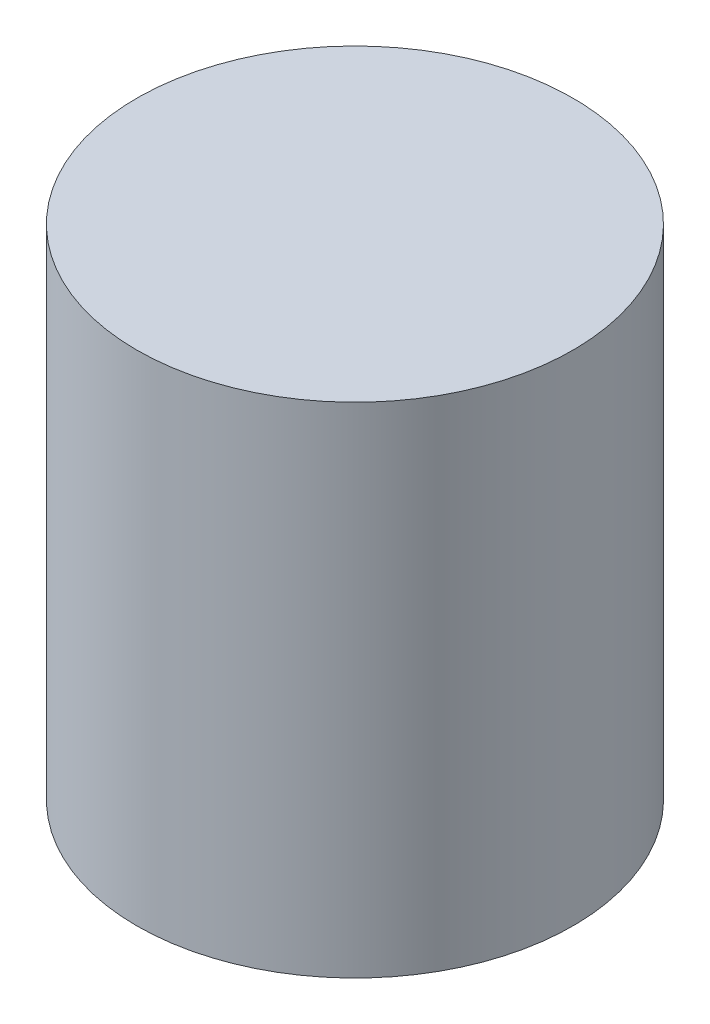
ISO-10303-21;
HEADER;
FILE_DESCRIPTION(('STEP AP214'),'2;1');
FILE_NAME('part.step','',(''),(''),'','','');
FILE_SCHEMA(('AUTOMOTIVE_DESIGN { 1 0 10303 214 1 1 1 1 }'));
ENDSEC;
DATA;
#1=APPLICATION_CONTEXT('core data for automotive mechanical design processes');
#2=APPLICATION_PROTOCOL_DEFINITION('international standard','automotive_design',2000,#1);
#3=PRODUCT_CONTEXT('',#1,'mechanical');
#4=PRODUCT('Part','Part','',(#3));
#5=PRODUCT_RELATED_PRODUCT_CATEGORY('part','',(#4));
#6=PRODUCT_DEFINITION_FORMATION('','',#4);
#7=PRODUCT_DEFINITION_CONTEXT('part definition',#1,'design');
#8=PRODUCT_DEFINITION('design','',#6,#7);
#9=PRODUCT_DEFINITION_SHAPE('','',#8);
#10=(LENGTH_UNIT() NAMED_UNIT(*) SI_UNIT(.MILLI.,.METRE.));
#11=(NAMED_UNIT(*) PLANE_ANGLE_UNIT() SI_UNIT($,.RADIAN.));
#12=(NAMED_UNIT(*) SI_UNIT($,.STERADIAN.) SOLID_ANGLE_UNIT());
#13=UNCERTAINTY_MEASURE_WITH_UNIT(LENGTH_MEASURE(1.E-05),#10,'distance_accuracy_value','');
#14=(GEOMETRIC_REPRESENTATION_CONTEXT(3) GLOBAL_UNCERTAINTY_ASSIGNED_CONTEXT((#13)) GLOBAL_UNIT_ASSIGNED_CONTEXT((#10,
#11,#12)) REPRESENTATION_CONTEXT('',''));
#15=CARTESIAN_POINT('',(0.,0.,0.));
#16=DIRECTION('',(0.,0.,1.));
#17=DIRECTION('',(1.,0.,0.));
#18=AXIS2_PLACEMENT_3D('',#15,#16,#17);
#19=CARTESIAN_POINT('',(-2.44791539592313,4.,0.958023949275084));
#20=DIRECTION('',(0.,-1.,0.));
#21=DIRECTION('',(0.,0.,-1.));
#22=AXIS2_PLACEMENT_3D('',#19,#20,#21);
#23=CYLINDRICAL_SURFACE('',#22,1.75);
#24=CARTESIAN_POINT('',(-2.44791539592313,4.,0.958023949275084));
#25=DIRECTION('',(0.,1.,0.));
#26=DIRECTION('',(0.,0.,1.));
#27=AXIS2_PLACEMENT_3D('',#24,#25,#26);
#28=CIRCLE('',#27,1.75);
#29=CARTESIAN_POINT('',(-2.44791539592313,4.,2.70802394927508));
#30=VERTEX_POINT('',#29);
#31=EDGE_CURVE('E10',#30,#30,#28,.T.);
#32=ORIENTED_EDGE('',*,*,#31,.F.);
#33=EDGE_LOOP('',(#32));
#34=FACE_BOUND('',#33,.T.);
#35=CARTESIAN_POINT('',(-2.44791539592313,0.,0.958023949275084));
#36=DIRECTION('',(0.,1.,0.));
#37=DIRECTION('',(0.,0.,1.));
#38=AXIS2_PLACEMENT_3D('',#35,#36,#37);
#39=CIRCLE('',#38,1.75);
#40=CARTESIAN_POINT('',(-2.44791539592313,0.,2.70802394927508));
#41=VERTEX_POINT('',#40);
#42=EDGE_CURVE('E35',#41,#41,#39,.T.);
#43=ORIENTED_EDGE('',*,*,#42,.T.);
#44=EDGE_LOOP('',(#43));
#45=FACE_BOUND('',#44,.T.);
#46=ADVANCED_FACE('F32',(#34,#45),#23,.T.);
#47=CARTESIAN_POINT('',(-2.44791539592313,4.,0.958023949275084));
#48=DIRECTION('',(0.,1.,0.));
#49=DIRECTION('',(0.,0.,1.));
#50=AXIS2_PLACEMENT_3D('',#47,#48,#49);
#51=PLANE('',#50);
#52=ORIENTED_EDGE('',*,*,#31,.T.);
#53=EDGE_LOOP('',(#52));
#54=FACE_BOUND('',#53,.T.);
#55=ADVANCED_FACE('F47',(#54),#51,.T.);
#56=CARTESIAN_POINT('',(-2.44791539592313,0.,0.958023949275084));
#57=DIRECTION('',(0.,1.,0.));
#58=DIRECTION('',(0.,0.,1.));
#59=AXIS2_PLACEMENT_3D('',#56,#57,#58);
#60=PLANE('',#59);
#61=ORIENTED_EDGE('',*,*,#42,.F.);
#62=EDGE_LOOP('',(#61));
#63=FACE_BOUND('',#62,.T.);
#64=ADVANCED_FACE('F45',(#63),#60,.F.);
#65=CLOSED_SHELL('',(#46,#55,#64));
#66=MANIFOLD_SOLID_BREP('B2',#65);
#67=ADVANCED_BREP_SHAPE_REPRESENTATION('',(#18,#66),#14);
#68=SHAPE_DEFINITION_REPRESENTATION(#9,#67);
ENDSEC;
END-ISO-10303-21;
